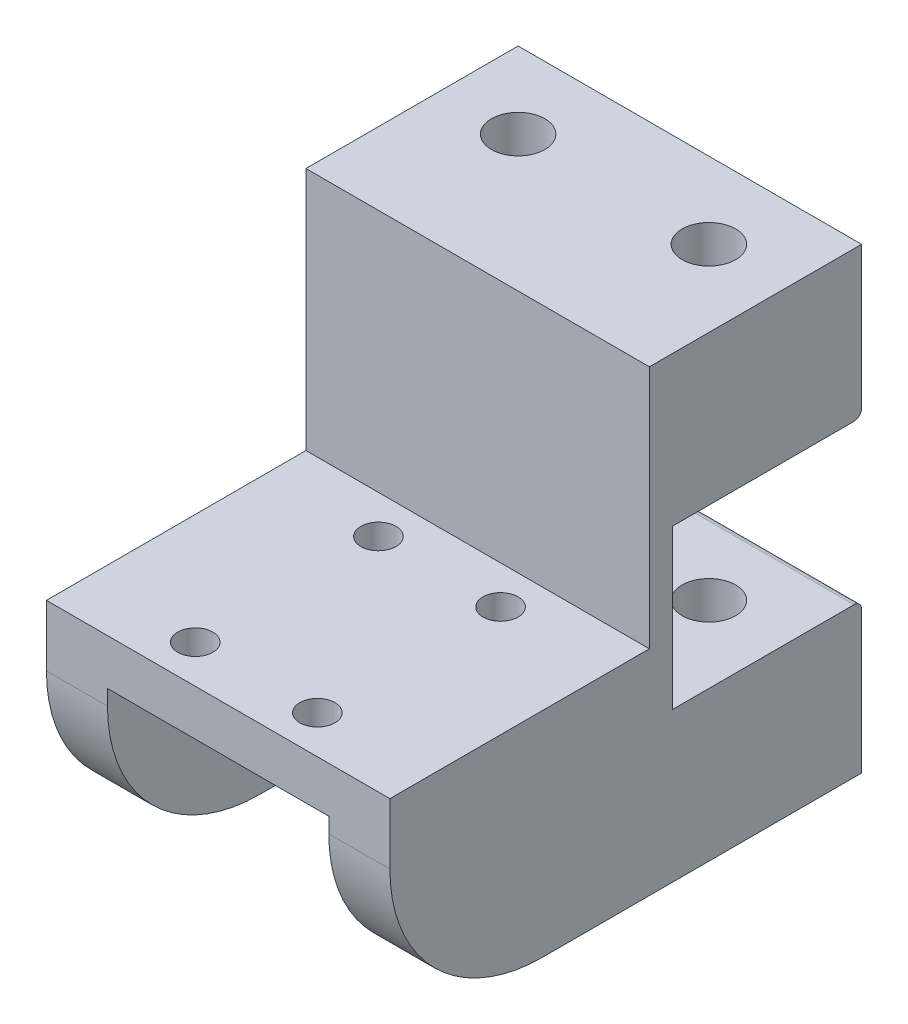
ISO-10303-21;
HEADER;
FILE_DESCRIPTION(('STEP AP214'),'2;1');
FILE_NAME('part.step','',(''),(''),'','','');
FILE_SCHEMA(('AUTOMOTIVE_DESIGN { 1 0 10303 214 1 1 1 1 }'));
ENDSEC;
DATA;
#1=APPLICATION_CONTEXT('core data for automotive mechanical design processes');
#2=APPLICATION_PROTOCOL_DEFINITION('international standard','automotive_design',2000,#1);
#3=PRODUCT_CONTEXT('',#1,'mechanical');
#4=PRODUCT('Part','Part','',(#3));
#5=PRODUCT_RELATED_PRODUCT_CATEGORY('part','',(#4));
#6=PRODUCT_DEFINITION_FORMATION('','',#4);
#7=PRODUCT_DEFINITION_CONTEXT('part definition',#1,'design');
#8=PRODUCT_DEFINITION('design','',#6,#7);
#9=PRODUCT_DEFINITION_SHAPE('','',#8);
#10=(LENGTH_UNIT() NAMED_UNIT(*) SI_UNIT(.MILLI.,.METRE.));
#11=(NAMED_UNIT(*) PLANE_ANGLE_UNIT() SI_UNIT($,.RADIAN.));
#12=(NAMED_UNIT(*) SI_UNIT($,.STERADIAN.) SOLID_ANGLE_UNIT());
#13=UNCERTAINTY_MEASURE_WITH_UNIT(LENGTH_MEASURE(1.E-05),#10,'distance_accuracy_value','');
#14=(GEOMETRIC_REPRESENTATION_CONTEXT(3) GLOBAL_UNCERTAINTY_ASSIGNED_CONTEXT((#13)) GLOBAL_UNIT_ASSIGNED_CONTEXT((#10,
#11,#12)) REPRESENTATION_CONTEXT('',''));
#15=CARTESIAN_POINT('',(0.,0.,0.));
#16=DIRECTION('',(0.,0.,1.));
#17=DIRECTION('',(1.,0.,0.));
#18=AXIS2_PLACEMENT_3D('',#15,#16,#17);
#19=CARTESIAN_POINT('',(0.,-11.,8.5));
#20=DIRECTION('',(0.,-1.,0.));
#21=DIRECTION('',(0.,0.,-1.));
#22=AXIS2_PLACEMENT_3D('',#19,#20,#21);
#23=PLANE('',#22);
#24=DIRECTION('',(0.,0.,-1.));
#25=VECTOR('',#24,1.);
#26=CARTESIAN_POINT('',(11.25,-11.,8.5));
#27=LINE('',#26,#25);
#28=CARTESIAN_POINT('',(11.25,-11.,-1.5));
#29=VERTEX_POINT('',#28);
#30=CARTESIAN_POINT('',(11.25,-11.,-22.4));
#31=VERTEX_POINT('',#30);
#32=EDGE_CURVE('E242',#29,#31,#27,.T.);
#33=ORIENTED_EDGE('',*,*,#32,.F.);
#34=DIRECTION('',(-1.,0.,0.));
#35=VECTOR('',#34,1.);
#36=CARTESIAN_POINT('',(7.25,-11.,-1.5));
#37=LINE('',#36,#35);
#38=CARTESIAN_POINT('',(7.25,-11.,-1.5));
#39=VERTEX_POINT('',#38);
#40=EDGE_CURVE('E325',#29,#39,#37,.T.);
#41=ORIENTED_EDGE('',*,*,#40,.T.);
#42=DIRECTION('',(0.,0.,1.));
#43=VECTOR('',#42,1.);
#44=CARTESIAN_POINT('',(7.25,-11.,0.));
#45=LINE('',#44,#43);
#46=CARTESIAN_POINT('',(7.25,-11.,-8.5));
#47=VERTEX_POINT('',#46);
#48=EDGE_CURVE('E239',#47,#39,#45,.T.);
#49=ORIENTED_EDGE('',*,*,#48,.F.);
#50=DIRECTION('',(-1.,0.,0.));
#51=VECTOR('',#50,1.);
#52=CARTESIAN_POINT('',(0.,-11.,-8.5));
#53=LINE('',#52,#51);
#54=CARTESIAN_POINT('',(-7.25,-11.,-8.5));
#55=VERTEX_POINT('',#54);
#56=EDGE_CURVE('E249',#47,#55,#53,.T.);
#57=ORIENTED_EDGE('',*,*,#56,.T.);
#58=DIRECTION('',(0.,0.,1.));
#59=VECTOR('',#58,1.);
#60=CARTESIAN_POINT('',(-7.25,-11.,0.));
#61=LINE('',#60,#59);
#62=CARTESIAN_POINT('',(-7.25,-11.,-1.5));
#63=VERTEX_POINT('',#62);
#64=EDGE_CURVE('E251',#55,#63,#61,.T.);
#65=ORIENTED_EDGE('',*,*,#64,.T.);
#66=DIRECTION('',(-1.,0.,0.));
#67=VECTOR('',#66,1.);
#68=CARTESIAN_POINT('',(-11.25,-11.,-1.5));
#69=LINE('',#68,#67);
#70=CARTESIAN_POINT('',(-11.25,-11.,-1.5));
#71=VERTEX_POINT('',#70);
#72=EDGE_CURVE('E322',#63,#71,#69,.T.);
#73=ORIENTED_EDGE('',*,*,#72,.T.);
#74=DIRECTION('',(0.,0.,-1.));
#75=VECTOR('',#74,1.);
#76=CARTESIAN_POINT('',(-11.25,-11.,8.5));
#77=LINE('',#76,#75);
#78=CARTESIAN_POINT('',(-11.25,-11.,-22.4));
#79=VERTEX_POINT('',#78);
#80=EDGE_CURVE('E236',#71,#79,#77,.T.);
#81=ORIENTED_EDGE('',*,*,#80,.T.);
#82=DIRECTION('',(1.,0.,0.));
#83=VECTOR('',#82,1.);
#84=CARTESIAN_POINT('',(-11.25,-11.,-22.4));
#85=LINE('',#84,#83);
#86=EDGE_CURVE('E226',#79,#31,#85,.T.);
#87=ORIENTED_EDGE('',*,*,#86,.T.);
#88=EDGE_LOOP('',(#33,#41,#49,#57,#65,#73,#81,#87));
#89=FACE_BOUND('',#88,.T.);
#90=CARTESIAN_POINT('',(6.25,-11.,-17.4));
#91=DIRECTION('',(0.,1.,0.));
#92=DIRECTION('',(0.,0.,1.));
#93=AXIS2_PLACEMENT_3D('',#90,#91,#92);
#94=CIRCLE('',#93,1.75000000000001);
#95=CARTESIAN_POINT('',(6.25,-11.,-15.65));
#96=VERTEX_POINT('',#95);
#97=EDGE_CURVE('E219',#96,#96,#94,.T.);
#98=ORIENTED_EDGE('',*,*,#97,.T.);
#99=EDGE_LOOP('',(#98));
#100=FACE_BOUND('',#99,.T.);
#101=CARTESIAN_POINT('',(-6.25,-11.,-17.4));
#102=DIRECTION('',(0.,1.,0.));
#103=DIRECTION('',(0.,0.,1.));
#104=AXIS2_PLACEMENT_3D('',#101,#102,#103);
#105=CIRCLE('',#104,1.75000000000001);
#106=CARTESIAN_POINT('',(-6.25,-11.,-15.65));
#107=VERTEX_POINT('',#106);
#108=EDGE_CURVE('E213',#107,#107,#105,.T.);
#109=ORIENTED_EDGE('',*,*,#108,.T.);
#110=EDGE_LOOP('',(#109));
#111=FACE_BOUND('',#110,.T.);
#112=ADVANCED_FACE('F43',(#89,#100,#111),#23,.T.);
#113=CARTESIAN_POINT('',(0.,0.,-8.5));
#114=DIRECTION('',(0.,0.,-1.));
#115=DIRECTION('',(-1.,0.,0.));
#116=AXIS2_PLACEMENT_3D('',#113,#114,#115);
#117=PLANE('',#116);
#118=ORIENTED_EDGE('',*,*,#56,.F.);
#119=DIRECTION('',(0.,1.,0.));
#120=VECTOR('',#119,1.);
#121=CARTESIAN_POINT('',(7.25,0.,-8.5));
#122=LINE('',#121,#120);
#123=CARTESIAN_POINT('',(7.25,0.,-8.5));
#124=VERTEX_POINT('',#123);
#125=EDGE_CURVE('E257',#47,#124,#122,.T.);
#126=ORIENTED_EDGE('',*,*,#125,.T.);
#127=DIRECTION('',(-1.,0.,0.));
#128=VECTOR('',#127,1.);
#129=CARTESIAN_POINT('',(-11.25,0.,-8.5));
#130=LINE('',#129,#128);
#131=CARTESIAN_POINT('',(-7.25,0.,-8.5));
#132=VERTEX_POINT('',#131);
#133=EDGE_CURVE('E301',#124,#132,#130,.T.);
#134=ORIENTED_EDGE('',*,*,#133,.T.);
#135=DIRECTION('',(0.,-1.,0.));
#136=VECTOR('',#135,1.);
#137=CARTESIAN_POINT('',(-7.25,0.,-8.5));
#138=LINE('',#137,#136);
#139=EDGE_CURVE('E265',#132,#55,#138,.T.);
#140=ORIENTED_EDGE('',*,*,#139,.T.);
#141=EDGE_LOOP('',(#118,#126,#134,#140));
#142=FACE_BOUND('',#141,.T.);
#143=ADVANCED_FACE('F397',(#142),#117,.F.);
#144=CARTESIAN_POINT('',(11.25,3.,-8.5));
#145=DIRECTION('',(-1.,0.,0.));
#146=DIRECTION('',(0.,0.,1.));
#147=AXIS2_PLACEMENT_3D('',#144,#145,#146);
#148=PLANE('',#147);
#149=DIRECTION('',(0.,-1.,0.));
#150=VECTOR('',#149,1.);
#151=CARTESIAN_POINT('',(11.25,-1.,-22.4));
#152=LINE('',#151,#150);
#153=CARTESIAN_POINT('',(11.25,-1.7,-22.4));
#154=VERTEX_POINT('',#153);
#155=EDGE_CURVE('E224',#154,#31,#152,.T.);
#156=ORIENTED_EDGE('',*,*,#155,.F.);
#157=CARTESIAN_POINT('',(11.25,-1.7,-21.9));
#158=DIRECTION('',(-1.,0.,0.));
#159=DIRECTION('',(0.,0.,1.));
#160=AXIS2_PLACEMENT_3D('',#157,#158,#159);
#161=CIRCLE('',#160,0.5);
#162=CARTESIAN_POINT('',(11.25,-1.2,-21.9));
#163=VERTEX_POINT('',#162);
#164=EDGE_CURVE('E347',#154,#163,#161,.F.);
#165=ORIENTED_EDGE('',*,*,#164,.T.);
#166=DIRECTION('',(0.,0.,-1.));
#167=VECTOR('',#166,1.);
#168=CARTESIAN_POINT('',(11.25,-1.2,-10.));
#169=LINE('',#168,#167);
#170=CARTESIAN_POINT('',(11.25,-1.2,-10.));
#171=VERTEX_POINT('',#170);
#172=EDGE_CURVE('E200',#171,#163,#169,.T.);
#173=ORIENTED_EDGE('',*,*,#172,.F.);
#174=DIRECTION('',(0.,-1.,0.));
#175=VECTOR('',#174,1.);
#176=CARTESIAN_POINT('',(11.25,0.,-10.));
#177=LINE('',#176,#175);
#178=CARTESIAN_POINT('',(11.25,9.2,-10.));
#179=VERTEX_POINT('',#178);
#180=EDGE_CURVE('E184',#179,#171,#177,.T.);
#181=ORIENTED_EDGE('',*,*,#180,.F.);
#182=DIRECTION('',(0.,0.,1.));
#183=VECTOR('',#182,1.);
#184=CARTESIAN_POINT('',(11.25,9.2,-10.));
#185=LINE('',#184,#183);
#186=CARTESIAN_POINT('',(11.25,9.2,-21.9));
#187=VERTEX_POINT('',#186);
#188=EDGE_CURVE('E176',#187,#179,#185,.T.);
#189=ORIENTED_EDGE('',*,*,#188,.F.);
#190=CARTESIAN_POINT('',(11.25,9.7,-21.9));
#191=DIRECTION('',(-1.,0.,0.));
#192=DIRECTION('',(0.,0.,1.));
#193=AXIS2_PLACEMENT_3D('',#190,#191,#192);
#194=CIRCLE('',#193,0.5);
#195=CARTESIAN_POINT('',(11.25,9.7,-22.4));
#196=VERTEX_POINT('',#195);
#197=EDGE_CURVE('E345',#187,#196,#194,.F.);
#198=ORIENTED_EDGE('',*,*,#197,.T.);
#199=DIRECTION('',(0.,-1.,0.));
#200=VECTOR('',#199,1.);
#201=CARTESIAN_POINT('',(11.25,19.,-22.4));
#202=LINE('',#201,#200);
#203=CARTESIAN_POINT('',(11.25,19.,-22.4));
#204=VERTEX_POINT('',#203);
#205=EDGE_CURVE('E234',#204,#196,#202,.T.);
#206=ORIENTED_EDGE('',*,*,#205,.F.);
#207=DIRECTION('',(0.,0.,-1.));
#208=VECTOR('',#207,1.);
#209=CARTESIAN_POINT('',(11.25,19.,8.5));
#210=LINE('',#209,#208);
#211=CARTESIAN_POINT('',(11.25,19.,-8.5));
#212=VERTEX_POINT('',#211);
#213=EDGE_CURVE('E240',#212,#204,#210,.T.);
#214=ORIENTED_EDGE('',*,*,#213,.F.);
#215=DIRECTION('',(0.,-1.,0.));
#216=VECTOR('',#215,1.);
#217=CARTESIAN_POINT('',(11.25,0.,-8.5));
#218=LINE('',#217,#216);
#219=CARTESIAN_POINT('',(11.25,3.,-8.5));
#220=VERTEX_POINT('',#219);
#221=EDGE_CURVE('E185',#212,#220,#218,.T.);
#222=ORIENTED_EDGE('',*,*,#221,.T.);
#223=DIRECTION('',(0.,0.,-1.));
#224=VECTOR('',#223,1.);
#225=CARTESIAN_POINT('',(11.25,3.,-8.5));
#226=LINE('',#225,#224);
#227=CARTESIAN_POINT('',(11.25,3.,8.5));
#228=VERTEX_POINT('',#227);
#229=EDGE_CURVE('E302',#228,#220,#226,.T.);
#230=ORIENTED_EDGE('',*,*,#229,.F.);
#231=DIRECTION('',(0.,-1.,0.));
#232=VECTOR('',#231,1.);
#233=CARTESIAN_POINT('',(11.25,3.,8.5));
#234=LINE('',#233,#232);
#235=CARTESIAN_POINT('',(11.25,-0.999999999999999,8.5));
#236=VERTEX_POINT('',#235);
#237=EDGE_CURVE('E313',#228,#236,#234,.T.);
#238=ORIENTED_EDGE('',*,*,#237,.T.);
#239=CARTESIAN_POINT('',(11.25,-0.999999999999999,-1.5));
#240=DIRECTION('',(-1.,0.,0.));
#241=DIRECTION('',(0.,0.,1.));
#242=AXIS2_PLACEMENT_3D('',#239,#240,#241);
#243=CIRCLE('',#242,10.);
#244=EDGE_CURVE('E334',#236,#29,#243,.F.);
#245=ORIENTED_EDGE('',*,*,#244,.T.);
#246=ORIENTED_EDGE('',*,*,#32,.T.);
#247=EDGE_LOOP('',(#156,#165,#173,#181,#189,#198,#206,#214,#222,#230,#238,#245,#246));
#248=FACE_BOUND('',#247,.T.);
#249=ADVANCED_FACE('F356',(#248),#148,.F.);
#250=CARTESIAN_POINT('',(-11.25,3.,-8.5));
#251=DIRECTION('',(1.,0.,0.));
#252=DIRECTION('',(0.,0.,-1.));
#253=AXIS2_PLACEMENT_3D('',#250,#251,#252);
#254=PLANE('',#253);
#255=DIRECTION('',(0.,0.,-1.));
#256=VECTOR('',#255,1.);
#257=CARTESIAN_POINT('',(-11.25,-1.2,-10.));
#258=LINE('',#257,#256);
#259=CARTESIAN_POINT('',(-11.25,-1.2,-10.));
#260=VERTEX_POINT('',#259);
#261=CARTESIAN_POINT('',(-11.25,-1.2,-21.9));
#262=VERTEX_POINT('',#261);
#263=EDGE_CURVE('E199',#260,#262,#258,.T.);
#264=ORIENTED_EDGE('',*,*,#263,.T.);
#265=CARTESIAN_POINT('',(-11.25,-1.7,-21.9));
#266=DIRECTION('',(1.,0.,0.));
#267=DIRECTION('',(0.,0.,-1.));
#268=AXIS2_PLACEMENT_3D('',#265,#266,#267);
#269=CIRCLE('',#268,0.5);
#270=CARTESIAN_POINT('',(-11.25,-1.7,-22.4));
#271=VERTEX_POINT('',#270);
#272=EDGE_CURVE('E352',#262,#271,#269,.F.);
#273=ORIENTED_EDGE('',*,*,#272,.T.);
#274=DIRECTION('',(0.,-1.,0.));
#275=VECTOR('',#274,1.);
#276=CARTESIAN_POINT('',(-11.25,-1.,-22.4));
#277=LINE('',#276,#275);
#278=EDGE_CURVE('E222',#271,#79,#277,.T.);
#279=ORIENTED_EDGE('',*,*,#278,.T.);
#280=ORIENTED_EDGE('',*,*,#80,.F.);
#281=CARTESIAN_POINT('',(-11.25,-0.999999999999999,-1.5));
#282=DIRECTION('',(1.,0.,0.));
#283=DIRECTION('',(0.,0.,-1.));
#284=AXIS2_PLACEMENT_3D('',#281,#282,#283);
#285=CIRCLE('',#284,10.);
#286=CARTESIAN_POINT('',(-11.25,-0.999999999999999,8.5));
#287=VERTEX_POINT('',#286);
#288=EDGE_CURVE('E336',#71,#287,#285,.F.);
#289=ORIENTED_EDGE('',*,*,#288,.T.);
#290=DIRECTION('',(0.,-1.,0.));
#291=VECTOR('',#290,1.);
#292=CARTESIAN_POINT('',(-11.25,3.,8.5));
#293=LINE('',#292,#291);
#294=CARTESIAN_POINT('',(-11.25,3.,8.5));
#295=VERTEX_POINT('',#294);
#296=EDGE_CURVE('E319',#295,#287,#293,.T.);
#297=ORIENTED_EDGE('',*,*,#296,.F.);
#298=DIRECTION('',(0.,0.,1.));
#299=VECTOR('',#298,1.);
#300=CARTESIAN_POINT('',(-11.25,3.,-8.5));
#301=LINE('',#300,#299);
#302=CARTESIAN_POINT('',(-11.25,3.,-8.5));
#303=VERTEX_POINT('',#302);
#304=EDGE_CURVE('E309',#303,#295,#301,.T.);
#305=ORIENTED_EDGE('',*,*,#304,.F.);
#306=DIRECTION('',(0.,-1.,0.));
#307=VECTOR('',#306,1.);
#308=CARTESIAN_POINT('',(-11.25,0.,-8.5));
#309=LINE('',#308,#307);
#310=CARTESIAN_POINT('',(-11.25,19.,-8.5));
#311=VERTEX_POINT('',#310);
#312=EDGE_CURVE('E272',#311,#303,#309,.T.);
#313=ORIENTED_EDGE('',*,*,#312,.F.);
#314=DIRECTION('',(0.,0.,-1.));
#315=VECTOR('',#314,1.);
#316=CARTESIAN_POINT('',(-11.25,19.,8.5));
#317=LINE('',#316,#315);
#318=CARTESIAN_POINT('',(-11.25,19.,-22.4));
#319=VERTEX_POINT('',#318);
#320=EDGE_CURVE('E237',#311,#319,#317,.T.);
#321=ORIENTED_EDGE('',*,*,#320,.T.);
#322=DIRECTION('',(0.,-1.,0.));
#323=VECTOR('',#322,1.);
#324=CARTESIAN_POINT('',(-11.25,19.,-22.4));
#325=LINE('',#324,#323);
#326=CARTESIAN_POINT('',(-11.25,9.7,-22.4));
#327=VERTEX_POINT('',#326);
#328=EDGE_CURVE('E229',#319,#327,#325,.T.);
#329=ORIENTED_EDGE('',*,*,#328,.T.);
#330=CARTESIAN_POINT('',(-11.25,9.7,-21.9));
#331=DIRECTION('',(1.,0.,0.));
#332=DIRECTION('',(0.,0.,-1.));
#333=AXIS2_PLACEMENT_3D('',#330,#331,#332);
#334=CIRCLE('',#333,0.5);
#335=CARTESIAN_POINT('',(-11.25,9.2,-21.9));
#336=VERTEX_POINT('',#335);
#337=EDGE_CURVE('E63',#327,#336,#334,.F.);
#338=ORIENTED_EDGE('',*,*,#337,.T.);
#339=DIRECTION('',(0.,0.,1.));
#340=VECTOR('',#339,1.);
#341=CARTESIAN_POINT('',(-11.25,9.2,-10.));
#342=LINE('',#341,#340);
#343=CARTESIAN_POINT('',(-11.25,9.2,-10.));
#344=VERTEX_POINT('',#343);
#345=EDGE_CURVE('E165',#336,#344,#342,.T.);
#346=ORIENTED_EDGE('',*,*,#345,.T.);
#347=DIRECTION('',(0.,-1.,0.));
#348=VECTOR('',#347,1.);
#349=CARTESIAN_POINT('',(-11.25,0.,-10.));
#350=LINE('',#349,#348);
#351=EDGE_CURVE('E169',#344,#260,#350,.T.);
#352=ORIENTED_EDGE('',*,*,#351,.T.);
#353=EDGE_LOOP('',(#264,#273,#279,#280,#289,#297,#305,#313,#321,#329,#338,#346,#352));
#354=FACE_BOUND('',#353,.T.);
#355=ADVANCED_FACE('F168',(#354),#254,.F.);
#356=CARTESIAN_POINT('',(-11.25,3.,8.5));
#357=DIRECTION('',(0.,0.,-1.));
#358=DIRECTION('',(-1.,0.,0.));
#359=AXIS2_PLACEMENT_3D('',#356,#357,#358);
#360=PLANE('',#359);
#361=DIRECTION('',(0.,-1.,0.));
#362=VECTOR('',#361,1.);
#363=CARTESIAN_POINT('',(7.25,0.,8.49999999999999));
#364=LINE('',#363,#362);
#365=CARTESIAN_POINT('',(7.25,0.,8.49999999999999));
#366=VERTEX_POINT('',#365);
#367=CARTESIAN_POINT('',(7.25,-0.999999999999999,8.49999999999999));
#368=VERTEX_POINT('',#367);
#369=EDGE_CURVE('E262',#366,#368,#364,.T.);
#370=ORIENTED_EDGE('',*,*,#369,.T.);
#371=DIRECTION('',(-1.,0.,0.));
#372=VECTOR('',#371,1.);
#373=CARTESIAN_POINT('',(11.25,-0.999999999999999,8.5));
#374=LINE('',#373,#372);
#375=EDGE_CURVE('E332',#368,#236,#374,.F.);
#376=ORIENTED_EDGE('',*,*,#375,.T.);
#377=ORIENTED_EDGE('',*,*,#237,.F.);
#378=DIRECTION('',(1.,0.,0.));
#379=VECTOR('',#378,1.);
#380=CARTESIAN_POINT('',(-11.25,3.,8.5));
#381=LINE('',#380,#379);
#382=EDGE_CURVE('E311',#295,#228,#381,.T.);
#383=ORIENTED_EDGE('',*,*,#382,.F.);
#384=ORIENTED_EDGE('',*,*,#296,.T.);
#385=DIRECTION('',(-1.,0.,0.));
#386=VECTOR('',#385,1.);
#387=CARTESIAN_POINT('',(-7.25,-0.999999999999999,8.5));
#388=LINE('',#387,#386);
#389=CARTESIAN_POINT('',(-7.25,-0.999999999999999,8.5));
#390=VERTEX_POINT('',#389);
#391=EDGE_CURVE('E330',#287,#390,#388,.F.);
#392=ORIENTED_EDGE('',*,*,#391,.T.);
#393=DIRECTION('',(0.,1.,0.));
#394=VECTOR('',#393,1.);
#395=CARTESIAN_POINT('',(-7.25,0.,8.5));
#396=LINE('',#395,#394);
#397=CARTESIAN_POINT('',(-7.25,0.,8.5));
#398=VERTEX_POINT('',#397);
#399=EDGE_CURVE('E268',#390,#398,#396,.T.);
#400=ORIENTED_EDGE('',*,*,#399,.T.);
#401=DIRECTION('',(1.,0.,0.));
#402=VECTOR('',#401,1.);
#403=CARTESIAN_POINT('',(-11.25,0.,8.5));
#404=LINE('',#403,#402);
#405=EDGE_CURVE('E306',#398,#366,#404,.T.);
#406=ORIENTED_EDGE('',*,*,#405,.T.);
#407=EDGE_LOOP('',(#370,#376,#377,#383,#384,#392,#400,#406));
#408=FACE_BOUND('',#407,.T.);
#409=ADVANCED_FACE('F384',(#408),#360,.F.);
#410=CARTESIAN_POINT('',(-7.25,0.,0.));
#411=DIRECTION('',(-1.,0.,0.));
#412=DIRECTION('',(0.,0.,1.));
#413=AXIS2_PLACEMENT_3D('',#410,#411,#412);
#414=PLANE('',#413);
#415=ORIENTED_EDGE('',*,*,#399,.F.);
#416=CARTESIAN_POINT('',(-7.25,-0.999999999999999,-1.5));
#417=DIRECTION('',(-1.,0.,0.));
#418=DIRECTION('',(0.,0.,1.));
#419=AXIS2_PLACEMENT_3D('',#416,#417,#418);
#420=CIRCLE('',#419,10.);
#421=EDGE_CURVE('E338',#390,#63,#420,.F.);
#422=ORIENTED_EDGE('',*,*,#421,.T.);
#423=ORIENTED_EDGE('',*,*,#64,.F.);
#424=ORIENTED_EDGE('',*,*,#139,.F.);
#425=DIRECTION('',(0.,0.,-1.));
#426=VECTOR('',#425,1.);
#427=CARTESIAN_POINT('',(-7.25,0.,-8.5));
#428=LINE('',#427,#426);
#429=EDGE_CURVE('E270',#398,#132,#428,.T.);
#430=ORIENTED_EDGE('',*,*,#429,.F.);
#431=EDGE_LOOP('',(#415,#422,#423,#424,#430));
#432=FACE_BOUND('',#431,.T.);
#433=ADVANCED_FACE('F391',(#432),#414,.F.);
#434=CARTESIAN_POINT('',(7.25,0.,0.));
#435=DIRECTION('',(-1.,0.,0.));
#436=DIRECTION('',(0.,0.,1.));
#437=AXIS2_PLACEMENT_3D('',#434,#435,#436);
#438=PLANE('',#437);
#439=ORIENTED_EDGE('',*,*,#48,.T.);
#440=CARTESIAN_POINT('',(7.25,-0.999999999999999,-1.5));
#441=DIRECTION('',(-1.,0.,0.));
#442=DIRECTION('',(0.,0.,1.));
#443=AXIS2_PLACEMENT_3D('',#440,#441,#442);
#444=CIRCLE('',#443,10.);
#445=EDGE_CURVE('E328',#39,#368,#444,.T.);
#446=ORIENTED_EDGE('',*,*,#445,.T.);
#447=ORIENTED_EDGE('',*,*,#369,.F.);
#448=DIRECTION('',(0.,0.,1.));
#449=VECTOR('',#448,1.);
#450=CARTESIAN_POINT('',(7.25,0.,-8.5));
#451=LINE('',#450,#449);
#452=EDGE_CURVE('E259',#124,#366,#451,.T.);
#453=ORIENTED_EDGE('',*,*,#452,.F.);
#454=ORIENTED_EDGE('',*,*,#125,.F.);
#455=EDGE_LOOP('',(#439,#446,#447,#453,#454));
#456=FACE_BOUND('',#455,.T.);
#457=ADVANCED_FACE('F400',(#456),#438,.T.);
#458=CARTESIAN_POINT('',(0.,0.,-10.));
#459=DIRECTION('',(0.,0.,-1.));
#460=DIRECTION('',(-1.,0.,0.));
#461=AXIS2_PLACEMENT_3D('',#458,#459,#460);
#462=PLANE('',#461);
#463=ORIENTED_EDGE('',*,*,#351,.F.);
#464=DIRECTION('',(1.,0.,0.));
#465=VECTOR('',#464,1.);
#466=CARTESIAN_POINT('',(-11.25,9.2,-10.));
#467=LINE('',#466,#465);
#468=EDGE_CURVE('E175',#344,#179,#467,.T.);
#469=ORIENTED_EDGE('',*,*,#468,.T.);
#470=ORIENTED_EDGE('',*,*,#180,.T.);
#471=DIRECTION('',(1.,0.,0.));
#472=VECTOR('',#471,1.);
#473=CARTESIAN_POINT('',(-11.25,-1.2,-10.));
#474=LINE('',#473,#472);
#475=EDGE_CURVE('E182',#260,#171,#474,.T.);
#476=ORIENTED_EDGE('',*,*,#475,.F.);
#477=EDGE_LOOP('',(#463,#469,#470,#476));
#478=FACE_BOUND('',#477,.T.);
#479=ADVANCED_FACE('F180',(#478),#462,.T.);
#480=CARTESIAN_POINT('',(0.,0.,0.));
#481=DIRECTION('',(0.,1.,0.));
#482=DIRECTION('',(0.,0.,1.));
#483=AXIS2_PLACEMENT_3D('',#480,#481,#482);
#484=PLANE('',#483);
#485=CARTESIAN_POINT('',(4.00000000000001,0.,6.));
#486=DIRECTION('',(0.,1.,0.));
#487=DIRECTION('',(0.,0.,1.));
#488=AXIS2_PLACEMENT_3D('',#485,#486,#487);
#489=CIRCLE('',#488,1.15000000000001);
#490=CARTESIAN_POINT('',(4.00000000000001,0.,7.15000000000001));
#491=VERTEX_POINT('',#490);
#492=EDGE_CURVE('E298',#491,#491,#489,.T.);
#493=ORIENTED_EDGE('',*,*,#492,.T.);
#494=EDGE_LOOP('',(#493));
#495=FACE_BOUND('',#494,.T.);
#496=CARTESIAN_POINT('',(-3.99999999999999,0.,6.));
#497=DIRECTION('',(0.,1.,0.));
#498=DIRECTION('',(0.,0.,1.));
#499=AXIS2_PLACEMENT_3D('',#496,#497,#498);
#500=CIRCLE('',#499,1.15000000000001);
#501=CARTESIAN_POINT('',(-3.99999999999999,0.,7.15000000000001));
#502=VERTEX_POINT('',#501);
#503=EDGE_CURVE('E292',#502,#502,#500,.T.);
#504=ORIENTED_EDGE('',*,*,#503,.T.);
#505=EDGE_LOOP('',(#504));
#506=FACE_BOUND('',#505,.T.);
#507=CARTESIAN_POINT('',(4.,0.,-6.));
#508=DIRECTION('',(0.,1.,0.));
#509=DIRECTION('',(0.,0.,1.));
#510=AXIS2_PLACEMENT_3D('',#507,#508,#509);
#511=CIRCLE('',#510,1.15000000000001);
#512=CARTESIAN_POINT('',(4.,0.,-4.84999999999999));
#513=VERTEX_POINT('',#512);
#514=EDGE_CURVE('E286',#513,#513,#511,.T.);
#515=ORIENTED_EDGE('',*,*,#514,.T.);
#516=EDGE_LOOP('',(#515));
#517=FACE_BOUND('',#516,.T.);
#518=CARTESIAN_POINT('',(-4.,0.,-6.));
#519=DIRECTION('',(0.,1.,0.));
#520=DIRECTION('',(0.,0.,1.));
#521=AXIS2_PLACEMENT_3D('',#518,#519,#520);
#522=CIRCLE('',#521,1.15000000000001);
#523=CARTESIAN_POINT('',(-4.,0.,-4.84999999999999));
#524=VERTEX_POINT('',#523);
#525=EDGE_CURVE('E280',#524,#524,#522,.T.);
#526=ORIENTED_EDGE('',*,*,#525,.T.);
#527=EDGE_LOOP('',(#526));
#528=FACE_BOUND('',#527,.T.);
#529=ORIENTED_EDGE('',*,*,#133,.F.);
#530=ORIENTED_EDGE('',*,*,#452,.T.);
#531=ORIENTED_EDGE('',*,*,#405,.F.);
#532=ORIENTED_EDGE('',*,*,#429,.T.);
#533=EDGE_LOOP('',(#529,#530,#531,#532));
#534=FACE_BOUND('',#533,.T.);
#535=ADVANCED_FACE('F404',(#495,#506,#517,#528,#534),#484,.F.);
#536=CARTESIAN_POINT('',(0.,3.,0.));
#537=DIRECTION('',(0.,1.,0.));
#538=DIRECTION('',(0.,0.,1.));
#539=AXIS2_PLACEMENT_3D('',#536,#537,#538);
#540=PLANE('',#539);
#541=CARTESIAN_POINT('',(-4.,3.,-6.));
#542=DIRECTION('',(0.,1.,0.));
#543=DIRECTION('',(0.,0.,1.));
#544=AXIS2_PLACEMENT_3D('',#541,#542,#543);
#545=CIRCLE('',#544,1.15000000000001);
#546=CARTESIAN_POINT('',(-4.,3.,-4.84999999999999));
#547=VERTEX_POINT('',#546);
#548=EDGE_CURVE('E275',#547,#547,#545,.T.);
#549=ORIENTED_EDGE('',*,*,#548,.F.);
#550=EDGE_LOOP('',(#549));
#551=FACE_BOUND('',#550,.T.);
#552=CARTESIAN_POINT('',(4.,3.,-6.));
#553=DIRECTION('',(0.,1.,0.));
#554=DIRECTION('',(0.,0.,1.));
#555=AXIS2_PLACEMENT_3D('',#552,#553,#554);
#556=CIRCLE('',#555,1.15000000000001);
#557=CARTESIAN_POINT('',(4.,3.,-4.84999999999999));
#558=VERTEX_POINT('',#557);
#559=EDGE_CURVE('E283',#558,#558,#556,.T.);
#560=ORIENTED_EDGE('',*,*,#559,.F.);
#561=EDGE_LOOP('',(#560));
#562=FACE_BOUND('',#561,.T.);
#563=CARTESIAN_POINT('',(-3.99999999999999,3.,6.));
#564=DIRECTION('',(0.,1.,0.));
#565=DIRECTION('',(0.,0.,1.));
#566=AXIS2_PLACEMENT_3D('',#563,#564,#565);
#567=CIRCLE('',#566,1.15000000000001);
#568=CARTESIAN_POINT('',(-3.99999999999999,3.,7.15000000000001));
#569=VERTEX_POINT('',#568);
#570=EDGE_CURVE('E289',#569,#569,#567,.T.);
#571=ORIENTED_EDGE('',*,*,#570,.F.);
#572=EDGE_LOOP('',(#571));
#573=FACE_BOUND('',#572,.T.);
#574=CARTESIAN_POINT('',(4.00000000000001,3.,6.));
#575=DIRECTION('',(0.,1.,0.));
#576=DIRECTION('',(0.,0.,1.));
#577=AXIS2_PLACEMENT_3D('',#574,#575,#576);
#578=CIRCLE('',#577,1.15000000000001);
#579=CARTESIAN_POINT('',(4.00000000000001,3.,7.15000000000001));
#580=VERTEX_POINT('',#579);
#581=EDGE_CURVE('E295',#580,#580,#578,.T.);
#582=ORIENTED_EDGE('',*,*,#581,.F.);
#583=EDGE_LOOP('',(#582));
#584=FACE_BOUND('',#583,.T.);
#585=ORIENTED_EDGE('',*,*,#229,.T.);
#586=DIRECTION('',(-1.,0.,0.));
#587=VECTOR('',#586,1.);
#588=CARTESIAN_POINT('',(-11.25,3.,-8.5));
#589=LINE('',#588,#587);
#590=EDGE_CURVE('E305',#220,#303,#589,.T.);
#591=ORIENTED_EDGE('',*,*,#590,.T.);
#592=ORIENTED_EDGE('',*,*,#304,.T.);
#593=ORIENTED_EDGE('',*,*,#382,.T.);
#594=EDGE_LOOP('',(#585,#591,#592,#593));
#595=FACE_BOUND('',#594,.T.);
#596=ADVANCED_FACE('F454',(#551,#562,#573,#584,#595),#540,.T.);
#597=CARTESIAN_POINT('',(4.00000000000001,3.,6.));
#598=DIRECTION('',(0.,1.,0.));
#599=DIRECTION('',(0.,0.,1.));
#600=AXIS2_PLACEMENT_3D('',#597,#598,#599);
#601=CYLINDRICAL_SURFACE('',#600,1.15000000000001);
#602=ORIENTED_EDGE('',*,*,#492,.F.);
#603=EDGE_LOOP('',(#602));
#604=FACE_BOUND('',#603,.T.);
#605=ORIENTED_EDGE('',*,*,#581,.T.);
#606=EDGE_LOOP('',(#605));
#607=FACE_BOUND('',#606,.T.);
#608=ADVANCED_FACE('F450',(#604,#607),#601,.F.);
#609=CARTESIAN_POINT('',(-3.99999999999999,3.,6.));
#610=DIRECTION('',(0.,1.,0.));
#611=DIRECTION('',(0.,0.,1.));
#612=AXIS2_PLACEMENT_3D('',#609,#610,#611);
#613=CYLINDRICAL_SURFACE('',#612,1.15000000000001);
#614=ORIENTED_EDGE('',*,*,#503,.F.);
#615=EDGE_LOOP('',(#614));
#616=FACE_BOUND('',#615,.T.);
#617=ORIENTED_EDGE('',*,*,#570,.T.);
#618=EDGE_LOOP('',(#617));
#619=FACE_BOUND('',#618,.T.);
#620=ADVANCED_FACE('F446',(#616,#619),#613,.F.);
#621=CARTESIAN_POINT('',(4.,3.,-6.));
#622=DIRECTION('',(0.,1.,0.));
#623=DIRECTION('',(0.,0.,1.));
#624=AXIS2_PLACEMENT_3D('',#621,#622,#623);
#625=CYLINDRICAL_SURFACE('',#624,1.15000000000001);
#626=ORIENTED_EDGE('',*,*,#514,.F.);
#627=EDGE_LOOP('',(#626));
#628=FACE_BOUND('',#627,.T.);
#629=ORIENTED_EDGE('',*,*,#559,.T.);
#630=EDGE_LOOP('',(#629));
#631=FACE_BOUND('',#630,.T.);
#632=ADVANCED_FACE('F442',(#628,#631),#625,.F.);
#633=CARTESIAN_POINT('',(-4.,3.,-6.));
#634=DIRECTION('',(0.,1.,0.));
#635=DIRECTION('',(0.,0.,1.));
#636=AXIS2_PLACEMENT_3D('',#633,#634,#635);
#637=CYLINDRICAL_SURFACE('',#636,1.15000000000001);
#638=ORIENTED_EDGE('',*,*,#525,.F.);
#639=EDGE_LOOP('',(#638));
#640=FACE_BOUND('',#639,.T.);
#641=ORIENTED_EDGE('',*,*,#548,.T.);
#642=EDGE_LOOP('',(#641));
#643=FACE_BOUND('',#642,.T.);
#644=ADVANCED_FACE('F438',(#640,#643),#637,.F.);
#645=ORIENTED_EDGE('',*,*,#221,.F.);
#646=DIRECTION('',(-1.,0.,0.));
#647=VECTOR('',#646,1.);
#648=CARTESIAN_POINT('',(0.,19.,-8.5));
#649=LINE('',#648,#647);
#650=EDGE_CURVE('E254',#212,#311,#649,.T.);
#651=ORIENTED_EDGE('',*,*,#650,.T.);
#652=ORIENTED_EDGE('',*,*,#312,.T.);
#653=ORIENTED_EDGE('',*,*,#590,.F.);
#654=EDGE_LOOP('',(#645,#651,#652,#653));
#655=FACE_BOUND('',#654,.T.);
#656=ADVANCED_FACE('F427',(#655),#117,.F.);
#657=CARTESIAN_POINT('',(0.,19.,8.5));
#658=DIRECTION('',(0.,-1.,0.));
#659=DIRECTION('',(0.,0.,-1.));
#660=AXIS2_PLACEMENT_3D('',#657,#658,#659);
#661=PLANE('',#660);
#662=CARTESIAN_POINT('',(-6.25,19.,-17.4));
#663=DIRECTION('',(0.,1.,0.));
#664=DIRECTION('',(0.,0.,1.));
#665=AXIS2_PLACEMENT_3D('',#662,#663,#664);
#666=CIRCLE('',#665,1.75000000000001);
#667=CARTESIAN_POINT('',(-6.25,19.,-15.65));
#668=VERTEX_POINT('',#667);
#669=EDGE_CURVE('E210',#668,#668,#666,.T.);
#670=ORIENTED_EDGE('',*,*,#669,.F.);
#671=EDGE_LOOP('',(#670));
#672=FACE_BOUND('',#671,.T.);
#673=CARTESIAN_POINT('',(6.25,19.,-17.4));
#674=DIRECTION('',(0.,1.,0.));
#675=DIRECTION('',(0.,0.,1.));
#676=AXIS2_PLACEMENT_3D('',#673,#674,#675);
#677=CIRCLE('',#676,1.75000000000001);
#678=CARTESIAN_POINT('',(6.25,19.,-15.65));
#679=VERTEX_POINT('',#678);
#680=EDGE_CURVE('E216',#679,#679,#677,.T.);
#681=ORIENTED_EDGE('',*,*,#680,.F.);
#682=EDGE_LOOP('',(#681));
#683=FACE_BOUND('',#682,.T.);
#684=ORIENTED_EDGE('',*,*,#213,.T.);
#685=DIRECTION('',(-1.,0.,0.));
#686=VECTOR('',#685,1.);
#687=CARTESIAN_POINT('',(11.25,19.,-22.4));
#688=LINE('',#687,#686);
#689=EDGE_CURVE('E231',#204,#319,#688,.T.);
#690=ORIENTED_EDGE('',*,*,#689,.T.);
#691=ORIENTED_EDGE('',*,*,#320,.F.);
#692=ORIENTED_EDGE('',*,*,#650,.F.);
#693=EDGE_LOOP('',(#684,#690,#691,#692));
#694=FACE_BOUND('',#693,.T.);
#695=ADVANCED_FACE('F430',(#672,#683,#694),#661,.F.);
#696=CARTESIAN_POINT('',(0.,0.,-22.4));
#697=DIRECTION('',(0.,0.,1.));
#698=DIRECTION('',(1.,0.,0.));
#699=AXIS2_PLACEMENT_3D('',#696,#697,#698);
#700=PLANE('',#699);
#701=ORIENTED_EDGE('',*,*,#205,.T.);
#702=DIRECTION('',(1.,0.,0.));
#703=VECTOR('',#702,1.);
#704=CARTESIAN_POINT('',(0.,9.7,-22.4));
#705=LINE('',#704,#703);
#706=EDGE_CURVE('E11',#196,#327,#705,.F.);
#707=ORIENTED_EDGE('',*,*,#706,.T.);
#708=ORIENTED_EDGE('',*,*,#328,.F.);
#709=ORIENTED_EDGE('',*,*,#689,.F.);
#710=EDGE_LOOP('',(#701,#707,#708,#709));
#711=FACE_BOUND('',#710,.T.);
#712=ADVANCED_FACE('F417',(#711),#700,.F.);
#713=CARTESIAN_POINT('',(0.,0.,-22.4));
#714=DIRECTION('',(0.,0.,-1.));
#715=DIRECTION('',(-1.,0.,0.));
#716=AXIS2_PLACEMENT_3D('',#713,#714,#715);
#717=PLANE('',#716);
#718=ORIENTED_EDGE('',*,*,#278,.F.);
#719=DIRECTION('',(1.,0.,0.));
#720=VECTOR('',#719,1.);
#721=CARTESIAN_POINT('',(11.25,-1.7,-22.4));
#722=LINE('',#721,#720);
#723=EDGE_CURVE('E339',#271,#154,#722,.T.);
#724=ORIENTED_EDGE('',*,*,#723,.T.);
#725=ORIENTED_EDGE('',*,*,#155,.T.);
#726=ORIENTED_EDGE('',*,*,#86,.F.);
#727=EDGE_LOOP('',(#718,#724,#725,#726));
#728=FACE_BOUND('',#727,.T.);
#729=ADVANCED_FACE('F369',(#728),#717,.T.);
#730=CARTESIAN_POINT('',(0.,-0.999999999999999,-1.5));
#731=DIRECTION('',(1.,0.,0.));
#732=DIRECTION('',(0.,0.,-1.));
#733=AXIS2_PLACEMENT_3D('',#730,#731,#732);
#734=CYLINDRICAL_SURFACE('',#733,10.);
#735=ORIENTED_EDGE('',*,*,#244,.F.);
#736=ORIENTED_EDGE('',*,*,#375,.F.);
#737=ORIENTED_EDGE('',*,*,#445,.F.);
#738=ORIENTED_EDGE('',*,*,#40,.F.);
#739=EDGE_LOOP('',(#735,#736,#737,#738));
#740=FACE_BOUND('',#739,.T.);
#741=ADVANCED_FACE('F407',(#740),#734,.T.);
#742=CARTESIAN_POINT('',(0.,-0.999999999999999,-1.5));
#743=DIRECTION('',(1.,0.,0.));
#744=DIRECTION('',(0.,0.,-1.));
#745=AXIS2_PLACEMENT_3D('',#742,#743,#744);
#746=CYLINDRICAL_SURFACE('',#745,10.);
#747=ORIENTED_EDGE('',*,*,#421,.F.);
#748=ORIENTED_EDGE('',*,*,#391,.F.);
#749=ORIENTED_EDGE('',*,*,#288,.F.);
#750=ORIENTED_EDGE('',*,*,#72,.F.);
#751=EDGE_LOOP('',(#747,#748,#749,#750));
#752=FACE_BOUND('',#751,.T.);
#753=ADVANCED_FACE('F388',(#752),#746,.T.);
#754=CARTESIAN_POINT('',(6.25,19.,-17.4));
#755=DIRECTION('',(0.,1.,0.));
#756=DIRECTION('',(0.,0.,1.));
#757=AXIS2_PLACEMENT_3D('',#754,#755,#756);
#758=CYLINDRICAL_SURFACE('',#757,1.75000000000001);
#759=CARTESIAN_POINT('',(6.25,-1.2,-17.4));
#760=DIRECTION('',(0.,-1.,0.));
#761=DIRECTION('',(0.,0.,-1.));
#762=AXIS2_PLACEMENT_3D('',#759,#760,#761);
#763=CIRCLE('',#762,1.75000000000001);
#764=CARTESIAN_POINT('',(6.25,-1.2,-19.15));
#765=VERTEX_POINT('',#764);
#766=EDGE_CURVE('E194',#765,#765,#763,.F.);
#767=ORIENTED_EDGE('',*,*,#766,.T.);
#768=EDGE_LOOP('',(#767));
#769=FACE_BOUND('',#768,.T.);
#770=ORIENTED_EDGE('',*,*,#97,.F.);
#771=EDGE_LOOP('',(#770));
#772=FACE_BOUND('',#771,.T.);
#773=ADVANCED_FACE('F414',(#769,#772),#758,.F.);
#774=CARTESIAN_POINT('',(6.25,9.2,-17.4));
#775=DIRECTION('',(0.,1.,0.));
#776=DIRECTION('',(0.,0.,1.));
#777=AXIS2_PLACEMENT_3D('',#774,#775,#776);
#778=CIRCLE('',#777,1.75000000000001);
#779=CARTESIAN_POINT('',(6.25,9.2,-15.65));
#780=VERTEX_POINT('',#779);
#781=EDGE_CURVE('E207',#780,#780,#778,.F.);
#782=ORIENTED_EDGE('',*,*,#781,.T.);
#783=EDGE_LOOP('',(#782));
#784=FACE_BOUND('',#783,.T.);
#785=ORIENTED_EDGE('',*,*,#680,.T.);
#786=EDGE_LOOP('',(#785));
#787=FACE_BOUND('',#786,.T.);
#788=ADVANCED_FACE('F538',(#784,#787),#758,.F.);
#789=CARTESIAN_POINT('',(-6.25,19.,-17.4));
#790=DIRECTION('',(0.,1.,0.));
#791=DIRECTION('',(0.,0.,1.));
#792=AXIS2_PLACEMENT_3D('',#789,#790,#791);
#793=CYLINDRICAL_SURFACE('',#792,1.75000000000001);
#794=CARTESIAN_POINT('',(-6.25,9.2,-17.4));
#795=DIRECTION('',(0.,1.,0.));
#796=DIRECTION('',(0.,0.,1.));
#797=AXIS2_PLACEMENT_3D('',#794,#795,#796);
#798=CIRCLE('',#797,1.75000000000001);
#799=CARTESIAN_POINT('',(-6.25,9.2,-15.65));
#800=VERTEX_POINT('',#799);
#801=EDGE_CURVE('E206',#800,#800,#798,.F.);
#802=ORIENTED_EDGE('',*,*,#801,.T.);
#803=EDGE_LOOP('',(#802));
#804=FACE_BOUND('',#803,.T.);
#805=ORIENTED_EDGE('',*,*,#669,.T.);
#806=EDGE_LOOP('',(#805));
#807=FACE_BOUND('',#806,.T.);
#808=ADVANCED_FACE('F529',(#804,#807),#793,.F.);
#809=CARTESIAN_POINT('',(-6.25,-1.2,-17.4));
#810=DIRECTION('',(0.,-1.,0.));
#811=DIRECTION('',(0.,0.,-1.));
#812=AXIS2_PLACEMENT_3D('',#809,#810,#811);
#813=CIRCLE('',#812,1.75000000000001);
#814=CARTESIAN_POINT('',(-6.25,-1.2,-19.15));
#815=VERTEX_POINT('',#814);
#816=EDGE_CURVE('E191',#815,#815,#813,.F.);
#817=ORIENTED_EDGE('',*,*,#816,.T.);
#818=EDGE_LOOP('',(#817));
#819=FACE_BOUND('',#818,.T.);
#820=ORIENTED_EDGE('',*,*,#108,.F.);
#821=EDGE_LOOP('',(#820));
#822=FACE_BOUND('',#821,.T.);
#823=ADVANCED_FACE('F473',(#819,#822),#793,.F.);
#824=CARTESIAN_POINT('',(-11.25,-1.2,-10.));
#825=DIRECTION('',(0.,-1.,0.));
#826=DIRECTION('',(0.,0.,-1.));
#827=AXIS2_PLACEMENT_3D('',#824,#825,#826);
#828=PLANE('',#827);
#829=ORIENTED_EDGE('',*,*,#816,.F.);
#830=EDGE_LOOP('',(#829));
#831=FACE_BOUND('',#830,.T.);
#832=ORIENTED_EDGE('',*,*,#172,.T.);
#833=DIRECTION('',(1.,0.,0.));
#834=VECTOR('',#833,1.);
#835=CARTESIAN_POINT('',(-11.25,-1.2,-21.9));
#836=LINE('',#835,#834);
#837=EDGE_CURVE('E349',#163,#262,#836,.F.);
#838=ORIENTED_EDGE('',*,*,#837,.T.);
#839=ORIENTED_EDGE('',*,*,#263,.F.);
#840=ORIENTED_EDGE('',*,*,#475,.T.);
#841=EDGE_LOOP('',(#832,#838,#839,#840));
#842=FACE_BOUND('',#841,.T.);
#843=ORIENTED_EDGE('',*,*,#766,.F.);
#844=EDGE_LOOP('',(#843));
#845=FACE_BOUND('',#844,.T.);
#846=ADVANCED_FACE('F360',(#831,#842,#845),#828,.F.);
#847=CARTESIAN_POINT('',(-11.25,9.2,-10.));
#848=DIRECTION('',(0.,1.,0.));
#849=DIRECTION('',(0.,0.,1.));
#850=AXIS2_PLACEMENT_3D('',#847,#848,#849);
#851=PLANE('',#850);
#852=ORIENTED_EDGE('',*,*,#801,.F.);
#853=EDGE_LOOP('',(#852));
#854=FACE_BOUND('',#853,.T.);
#855=ORIENTED_EDGE('',*,*,#345,.F.);
#856=DIRECTION('',(1.,0.,0.));
#857=VECTOR('',#856,1.);
#858=CARTESIAN_POINT('',(-11.25,9.2,-21.9));
#859=LINE('',#858,#857);
#860=EDGE_CURVE('E51',#336,#187,#859,.T.);
#861=ORIENTED_EDGE('',*,*,#860,.T.);
#862=ORIENTED_EDGE('',*,*,#188,.T.);
#863=ORIENTED_EDGE('',*,*,#468,.F.);
#864=EDGE_LOOP('',(#855,#861,#862,#863));
#865=FACE_BOUND('',#864,.T.);
#866=ORIENTED_EDGE('',*,*,#781,.F.);
#867=EDGE_LOOP('',(#866));
#868=FACE_BOUND('',#867,.T.);
#869=ADVANCED_FACE('F187',(#854,#865,#868),#851,.F.);
#870=CARTESIAN_POINT('',(0.,-1.7,-21.9));
#871=DIRECTION('',(-1.,0.,0.));
#872=DIRECTION('',(0.,0.,1.));
#873=AXIS2_PLACEMENT_3D('',#870,#871,#872);
#874=CYLINDRICAL_SURFACE('',#873,0.5);
#875=ORIENTED_EDGE('',*,*,#272,.F.);
#876=ORIENTED_EDGE('',*,*,#837,.F.);
#877=ORIENTED_EDGE('',*,*,#164,.F.);
#878=ORIENTED_EDGE('',*,*,#723,.F.);
#879=EDGE_LOOP('',(#875,#876,#877,#878));
#880=FACE_BOUND('',#879,.T.);
#881=ADVANCED_FACE('F367',(#880),#874,.T.);
#882=CARTESIAN_POINT('',(-11.25,9.7,-21.9));
#883=DIRECTION('',(1.,0.,0.));
#884=DIRECTION('',(0.,0.,-1.));
#885=AXIS2_PLACEMENT_3D('',#882,#883,#884);
#886=CYLINDRICAL_SURFACE('',#885,0.5);
#887=ORIENTED_EDGE('',*,*,#337,.F.);
#888=ORIENTED_EDGE('',*,*,#706,.F.);
#889=ORIENTED_EDGE('',*,*,#197,.F.);
#890=ORIENTED_EDGE('',*,*,#860,.F.);
#891=EDGE_LOOP('',(#887,#888,#889,#890));
#892=FACE_BOUND('',#891,.T.);
#893=ADVANCED_FACE('F45',(#892),#886,.T.);
#894=CLOSED_SHELL('',(#112,#143,#249,#355,#409,#433,#457,#479,#535,#596,#608,#620,#632,#644,
#656,#695,#712,#729,#741,#753,#773,#788,#808,#823,#846,#869,#881,#893));
#895=MANIFOLD_SOLID_BREP('B2',#894);
#896=ADVANCED_BREP_SHAPE_REPRESENTATION('',(#18,#895),#14);
#897=SHAPE_DEFINITION_REPRESENTATION(#9,#896);
ENDSEC;
END-ISO-10303-21;
